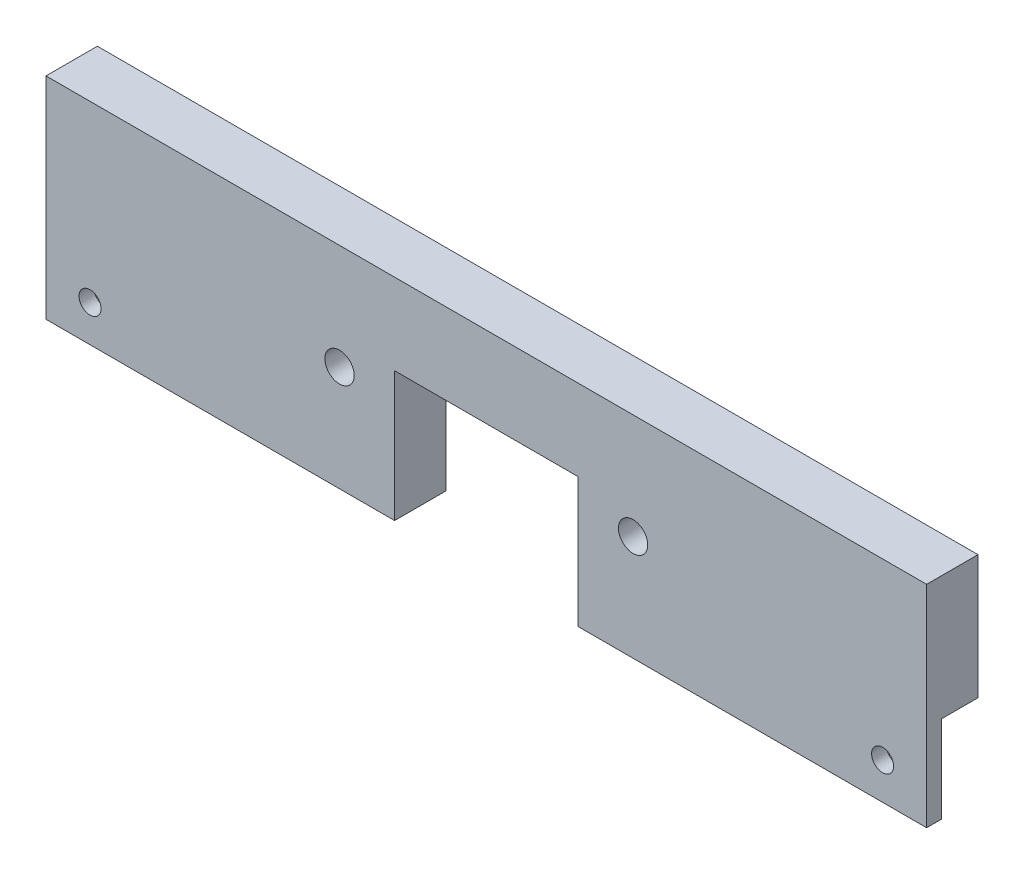
ISO-10303-21;
HEADER;
FILE_DESCRIPTION(('STEP AP214'),'2;1');
FILE_NAME('part.step','',(''),(''),'','','');
FILE_SCHEMA(('AUTOMOTIVE_DESIGN { 1 0 10303 214 1 1 1 1 }'));
ENDSEC;
DATA;
#1=APPLICATION_CONTEXT('core data for automotive mechanical design processes');
#2=APPLICATION_PROTOCOL_DEFINITION('international standard','automotive_design',2000,#1);
#3=PRODUCT_CONTEXT('',#1,'mechanical');
#4=PRODUCT('Part','Part','',(#3));
#5=PRODUCT_RELATED_PRODUCT_CATEGORY('part','',(#4));
#6=PRODUCT_DEFINITION_FORMATION('','',#4);
#7=PRODUCT_DEFINITION_CONTEXT('part definition',#1,'design');
#8=PRODUCT_DEFINITION('design','',#6,#7);
#9=PRODUCT_DEFINITION_SHAPE('','',#8);
#10=(LENGTH_UNIT() NAMED_UNIT(*) SI_UNIT(.MILLI.,.METRE.));
#11=(NAMED_UNIT(*) PLANE_ANGLE_UNIT() SI_UNIT($,.RADIAN.));
#12=(NAMED_UNIT(*) SI_UNIT($,.STERADIAN.) SOLID_ANGLE_UNIT());
#13=UNCERTAINTY_MEASURE_WITH_UNIT(LENGTH_MEASURE(1.E-05),#10,'distance_accuracy_value','');
#14=(GEOMETRIC_REPRESENTATION_CONTEXT(3) GLOBAL_UNCERTAINTY_ASSIGNED_CONTEXT((#13)) GLOBAL_UNIT_ASSIGNED_CONTEXT((#10,
#11,#12)) REPRESENTATION_CONTEXT('',''));
#15=CARTESIAN_POINT('',(0.,0.,0.));
#16=DIRECTION('',(0.,0.,1.));
#17=DIRECTION('',(1.,0.,0.));
#18=AXIS2_PLACEMENT_3D('',#15,#16,#17);
#19=CARTESIAN_POINT('',(-60.,11.27,7.));
#20=DIRECTION('',(0.,1.,0.));
#21=DIRECTION('',(-1.,0.,0.));
#22=AXIS2_PLACEMENT_3D('',#19,#20,#21);
#23=PLANE('',#22);
#24=DIRECTION('',(1.,0.,0.));
#25=VECTOR('',#24,1.);
#26=CARTESIAN_POINT('',(-60.,11.27,0.));
#27=LINE('',#26,#25);
#28=CARTESIAN_POINT('',(-48.,11.27,0.));
#29=VERTEX_POINT('',#28);
#30=CARTESIAN_POINT('',(-12.5,11.27,0.));
#31=VERTEX_POINT('',#30);
#32=EDGE_CURVE('E232',#29,#31,#27,.T.);
#33=ORIENTED_EDGE('',*,*,#32,.T.);
#34=DIRECTION('',(0.,0.,1.));
#35=VECTOR('',#34,1.);
#36=CARTESIAN_POINT('',(-12.5,11.27,7.));
#37=LINE('',#36,#35);
#38=CARTESIAN_POINT('',(-12.5,11.27,7.));
#39=VERTEX_POINT('',#38);
#40=EDGE_CURVE('E11',#31,#39,#37,.T.);
#41=ORIENTED_EDGE('',*,*,#40,.T.);
#42=DIRECTION('',(1.,0.,0.));
#43=VECTOR('',#42,1.);
#44=CARTESIAN_POINT('',(-60.,11.27,7.));
#45=LINE('',#44,#43);
#46=CARTESIAN_POINT('',(-60.,11.27,7.));
#47=VERTEX_POINT('',#46);
#48=EDGE_CURVE('E221',#47,#39,#45,.T.);
#49=ORIENTED_EDGE('',*,*,#48,.F.);
#50=DIRECTION('',(0.,0.,-1.));
#51=VECTOR('',#50,1.);
#52=CARTESIAN_POINT('',(-60.,11.27,7.));
#53=LINE('',#52,#51);
#54=CARTESIAN_POINT('',(-60.,11.27,5.));
#55=VERTEX_POINT('',#54);
#56=EDGE_CURVE('E245',#47,#55,#53,.T.);
#57=ORIENTED_EDGE('',*,*,#56,.T.);
#58=DIRECTION('',(1.,0.,0.));
#59=VECTOR('',#58,1.);
#60=CARTESIAN_POINT('',(-60.,11.27,5.));
#61=LINE('',#60,#59);
#62=CARTESIAN_POINT('',(-48.,11.27,5.));
#63=VERTEX_POINT('',#62);
#64=EDGE_CURVE('E181',#55,#63,#61,.T.);
#65=ORIENTED_EDGE('',*,*,#64,.T.);
#66=DIRECTION('',(0.,0.,-1.));
#67=VECTOR('',#66,1.);
#68=CARTESIAN_POINT('',(-48.,11.27,7.));
#69=LINE('',#68,#67);
#70=EDGE_CURVE('E253',#63,#29,#69,.T.);
#71=ORIENTED_EDGE('',*,*,#70,.T.);
#72=EDGE_LOOP('',(#33,#41,#49,#57,#65,#71));
#73=FACE_BOUND('',#72,.T.);
#74=ADVANCED_FACE('F32',(#73),#23,.F.);
#75=CARTESIAN_POINT('',(54.,16.27,7.));
#76=DIRECTION('',(0.,0.,-1.));
#77=DIRECTION('',(-1.,0.,0.));
#78=AXIS2_PLACEMENT_3D('',#75,#76,#77);
#79=CYLINDRICAL_SURFACE('',#78,1.5);
#80=CARTESIAN_POINT('',(54.,16.27,7.));
#81=DIRECTION('',(0.,0.,1.));
#82=DIRECTION('',(1.,0.,0.));
#83=AXIS2_PLACEMENT_3D('',#80,#81,#82);
#84=CIRCLE('',#83,1.5);
#85=CARTESIAN_POINT('',(55.5,16.27,7.));
#86=VERTEX_POINT('',#85);
#87=EDGE_CURVE('E209',#86,#86,#84,.T.);
#88=ORIENTED_EDGE('',*,*,#87,.T.);
#89=EDGE_LOOP('',(#88));
#90=FACE_BOUND('',#89,.T.);
#91=CARTESIAN_POINT('',(54.,16.27,5.));
#92=DIRECTION('',(0.,0.,-1.));
#93=DIRECTION('',(-1.,0.,0.));
#94=AXIS2_PLACEMENT_3D('',#91,#92,#93);
#95=CIRCLE('',#94,1.5);
#96=CARTESIAN_POINT('',(52.5,16.27,5.));
#97=VERTEX_POINT('',#96);
#98=EDGE_CURVE('E198',#97,#97,#95,.T.);
#99=ORIENTED_EDGE('',*,*,#98,.T.);
#100=EDGE_LOOP('',(#99));
#101=FACE_BOUND('',#100,.T.);
#102=ADVANCED_FACE('F295',(#90,#101),#79,.F.);
#103=CARTESIAN_POINT('',(0.,0.,7.));
#104=DIRECTION('',(0.,0.,-1.));
#105=DIRECTION('',(-1.,0.,0.));
#106=AXIS2_PLACEMENT_3D('',#103,#104,#105);
#107=PLANE('',#106);
#108=ORIENTED_EDGE('',*,*,#48,.T.);
#109=DIRECTION('',(0.,-1.,0.));
#110=VECTOR('',#109,1.);
#111=CARTESIAN_POINT('',(-12.5,-17.7863102306264,7.));
#112=LINE('',#111,#110);
#113=CARTESIAN_POINT('',(-12.5,28.9607474705575,7.));
#114=VERTEX_POINT('',#113);
#115=EDGE_CURVE('E156',#114,#39,#112,.T.);
#116=ORIENTED_EDGE('',*,*,#115,.F.);
#117=DIRECTION('',(-1.,0.,0.));
#118=VECTOR('',#117,1.);
#119=CARTESIAN_POINT('',(-12.5,28.9607474705575,7.));
#120=LINE('',#119,#118);
#121=CARTESIAN_POINT('',(12.5,28.9607474705575,7.));
#122=VERTEX_POINT('',#121);
#123=EDGE_CURVE('E151',#122,#114,#120,.T.);
#124=ORIENTED_EDGE('',*,*,#123,.F.);
#125=DIRECTION('',(0.,1.,0.));
#126=VECTOR('',#125,1.);
#127=CARTESIAN_POINT('',(12.5,-17.7863102306264,7.));
#128=LINE('',#127,#126);
#129=CARTESIAN_POINT('',(12.5,11.27,7.));
#130=VERTEX_POINT('',#129);
#131=EDGE_CURVE('E161',#130,#122,#128,.T.);
#132=ORIENTED_EDGE('',*,*,#131,.F.);
#133=CARTESIAN_POINT('',(60.,11.27,7.));
#134=VERTEX_POINT('',#133);
#135=EDGE_CURVE('E219',#130,#134,#45,.T.);
#136=ORIENTED_EDGE('',*,*,#135,.T.);
#137=DIRECTION('',(0.,1.,0.));
#138=VECTOR('',#137,1.);
#139=CARTESIAN_POINT('',(60.,11.27,7.));
#140=LINE('',#139,#138);
#141=CARTESIAN_POINT('',(60.,40.,7.));
#142=VERTEX_POINT('',#141);
#143=EDGE_CURVE('E224',#134,#142,#140,.T.);
#144=ORIENTED_EDGE('',*,*,#143,.T.);
#145=DIRECTION('',(-1.,0.,0.));
#146=VECTOR('',#145,1.);
#147=CARTESIAN_POINT('',(-60.,40.,7.));
#148=LINE('',#147,#146);
#149=CARTESIAN_POINT('',(-60.,40.,7.));
#150=VERTEX_POINT('',#149);
#151=EDGE_CURVE('E226',#142,#150,#148,.T.);
#152=ORIENTED_EDGE('',*,*,#151,.T.);
#153=DIRECTION('',(0.,-1.,0.));
#154=VECTOR('',#153,1.);
#155=CARTESIAN_POINT('',(-60.,11.27,7.));
#156=LINE('',#155,#154);
#157=EDGE_CURVE('E216',#150,#47,#156,.T.);
#158=ORIENTED_EDGE('',*,*,#157,.T.);
#159=EDGE_LOOP('',(#108,#116,#124,#132,#136,#144,#152,#158));
#160=FACE_BOUND('',#159,.T.);
#161=CARTESIAN_POINT('',(-54.,16.27,7.));
#162=DIRECTION('',(0.,0.,1.));
#163=DIRECTION('',(1.,0.,0.));
#164=AXIS2_PLACEMENT_3D('',#161,#162,#163);
#165=CIRCLE('',#164,1.5);
#166=CARTESIAN_POINT('',(-52.5,16.27,7.));
#167=VERTEX_POINT('',#166);
#168=EDGE_CURVE('E212',#167,#167,#165,.T.);
#169=ORIENTED_EDGE('',*,*,#168,.F.);
#170=EDGE_LOOP('',(#169));
#171=FACE_BOUND('',#170,.T.);
#172=ORIENTED_EDGE('',*,*,#87,.F.);
#173=EDGE_LOOP('',(#172));
#174=FACE_BOUND('',#173,.T.);
#175=CARTESIAN_POINT('',(-20.,25.635,7.));
#176=DIRECTION('',(0.,0.,1.));
#177=DIRECTION('',(1.,0.,0.));
#178=AXIS2_PLACEMENT_3D('',#175,#176,#177);
#179=CIRCLE('',#178,2.);
#180=CARTESIAN_POINT('',(-18.,25.635,7.));
#181=VERTEX_POINT('',#180);
#182=EDGE_CURVE('E206',#181,#181,#179,.T.);
#183=ORIENTED_EDGE('',*,*,#182,.F.);
#184=EDGE_LOOP('',(#183));
#185=FACE_BOUND('',#184,.T.);
#186=CARTESIAN_POINT('',(20.,25.635,7.));
#187=DIRECTION('',(0.,0.,1.));
#188=DIRECTION('',(-1.,0.,0.));
#189=AXIS2_PLACEMENT_3D('',#186,#187,#188);
#190=CIRCLE('',#189,2.);
#191=CARTESIAN_POINT('',(18.,25.635,7.));
#192=VERTEX_POINT('',#191);
#193=EDGE_CURVE('E203',#192,#192,#190,.T.);
#194=ORIENTED_EDGE('',*,*,#193,.F.);
#195=EDGE_LOOP('',(#194));
#196=FACE_BOUND('',#195,.T.);
#197=ADVANCED_FACE('F292',(#160,#171,#174,#185,#196),#107,.F.);
#198=CARTESIAN_POINT('',(0.,0.,0.));
#199=DIRECTION('',(0.,0.,-1.));
#200=DIRECTION('',(-1.,0.,0.));
#201=AXIS2_PLACEMENT_3D('',#198,#199,#200);
#202=PLANE('',#201);
#203=CARTESIAN_POINT('',(-20.,25.635,0.));
#204=DIRECTION('',(0.,0.,1.));
#205=DIRECTION('',(1.,0.,0.));
#206=AXIS2_PLACEMENT_3D('',#203,#204,#205);
#207=CIRCLE('',#206,4.);
#208=CARTESIAN_POINT('',(-16.,25.635,0.));
#209=VERTEX_POINT('',#208);
#210=EDGE_CURVE('E271',#209,#209,#207,.T.);
#211=ORIENTED_EDGE('',*,*,#210,.T.);
#212=EDGE_LOOP('',(#211));
#213=FACE_BOUND('',#212,.T.);
#214=CARTESIAN_POINT('',(20.,25.635,0.));
#215=DIRECTION('',(0.,0.,1.));
#216=DIRECTION('',(1.,0.,0.));
#217=AXIS2_PLACEMENT_3D('',#214,#215,#216);
#218=CIRCLE('',#217,4.);
#219=CARTESIAN_POINT('',(24.,25.635,0.));
#220=VERTEX_POINT('',#219);
#221=EDGE_CURVE('E264',#220,#220,#218,.T.);
#222=ORIENTED_EDGE('',*,*,#221,.T.);
#223=EDGE_LOOP('',(#222));
#224=FACE_BOUND('',#223,.T.);
#225=DIRECTION('',(0.,-1.,0.));
#226=VECTOR('',#225,1.);
#227=CARTESIAN_POINT('',(-12.5,-17.7863102306264,0.));
#228=LINE('',#227,#226);
#229=CARTESIAN_POINT('',(-12.5,28.9607474705575,0.));
#230=VERTEX_POINT('',#229);
#231=EDGE_CURVE('E136',#230,#31,#228,.T.);
#232=ORIENTED_EDGE('',*,*,#231,.T.);
#233=ORIENTED_EDGE('',*,*,#32,.F.);
#234=DIRECTION('',(0.,-1.,0.));
#235=VECTOR('',#234,1.);
#236=CARTESIAN_POINT('',(-48.,23.11,0.));
#237=LINE('',#236,#235);
#238=CARTESIAN_POINT('',(-48.,23.11,0.));
#239=VERTEX_POINT('',#238);
#240=EDGE_CURVE('E170',#239,#29,#237,.T.);
#241=ORIENTED_EDGE('',*,*,#240,.F.);
#242=DIRECTION('',(1.,0.,0.));
#243=VECTOR('',#242,1.);
#244=CARTESIAN_POINT('',(-60.,23.11,0.));
#245=LINE('',#244,#243);
#246=CARTESIAN_POINT('',(-60.,23.11,0.));
#247=VERTEX_POINT('',#246);
#248=EDGE_CURVE('E166',#247,#239,#245,.T.);
#249=ORIENTED_EDGE('',*,*,#248,.F.);
#250=DIRECTION('',(0.,-1.,0.));
#251=VECTOR('',#250,1.);
#252=CARTESIAN_POINT('',(-60.,11.27,0.));
#253=LINE('',#252,#251);
#254=CARTESIAN_POINT('',(-60.,40.,0.));
#255=VERTEX_POINT('',#254);
#256=EDGE_CURVE('E215',#255,#247,#253,.T.);
#257=ORIENTED_EDGE('',*,*,#256,.F.);
#258=DIRECTION('',(-1.,0.,0.));
#259=VECTOR('',#258,1.);
#260=CARTESIAN_POINT('',(-60.,40.,0.));
#261=LINE('',#260,#259);
#262=CARTESIAN_POINT('',(60.,40.,0.));
#263=VERTEX_POINT('',#262);
#264=EDGE_CURVE('E220',#263,#255,#261,.T.);
#265=ORIENTED_EDGE('',*,*,#264,.F.);
#266=DIRECTION('',(0.,1.,0.));
#267=VECTOR('',#266,1.);
#268=CARTESIAN_POINT('',(60.,11.27,0.));
#269=LINE('',#268,#267);
#270=CARTESIAN_POINT('',(60.,23.11,0.));
#271=VERTEX_POINT('',#270);
#272=EDGE_CURVE('E234',#271,#263,#269,.T.);
#273=ORIENTED_EDGE('',*,*,#272,.F.);
#274=DIRECTION('',(1.,0.,0.));
#275=VECTOR('',#274,1.);
#276=CARTESIAN_POINT('',(60.,23.11,0.));
#277=LINE('',#276,#275);
#278=CARTESIAN_POINT('',(48.,23.11,0.));
#279=VERTEX_POINT('',#278);
#280=EDGE_CURVE('E188',#279,#271,#277,.T.);
#281=ORIENTED_EDGE('',*,*,#280,.F.);
#282=DIRECTION('',(0.,1.,0.));
#283=VECTOR('',#282,1.);
#284=CARTESIAN_POINT('',(48.,23.11,0.));
#285=LINE('',#284,#283);
#286=CARTESIAN_POINT('',(48.,11.27,0.));
#287=VERTEX_POINT('',#286);
#288=EDGE_CURVE('E184',#287,#279,#285,.T.);
#289=ORIENTED_EDGE('',*,*,#288,.F.);
#290=CARTESIAN_POINT('',(12.5,11.27,0.));
#291=VERTEX_POINT('',#290);
#292=EDGE_CURVE('E231',#291,#287,#27,.T.);
#293=ORIENTED_EDGE('',*,*,#292,.F.);
#294=DIRECTION('',(0.,1.,0.));
#295=VECTOR('',#294,1.);
#296=CARTESIAN_POINT('',(12.5,-17.7863102306264,0.));
#297=LINE('',#296,#295);
#298=CARTESIAN_POINT('',(12.5,28.9607474705575,0.));
#299=VERTEX_POINT('',#298);
#300=EDGE_CURVE('E49',#291,#299,#297,.T.);
#301=ORIENTED_EDGE('',*,*,#300,.T.);
#302=DIRECTION('',(-1.,0.,0.));
#303=VECTOR('',#302,1.);
#304=CARTESIAN_POINT('',(-12.5,28.9607474705575,0.));
#305=LINE('',#304,#303);
#306=EDGE_CURVE('E149',#299,#230,#305,.T.);
#307=ORIENTED_EDGE('',*,*,#306,.T.);
#308=EDGE_LOOP('',(#232,#233,#241,#249,#257,#265,#273,#281,#289,#293,#301,#307));
#309=FACE_BOUND('',#308,.T.);
#310=ADVANCED_FACE('F154',(#213,#224,#309),#202,.T.);
#311=CARTESIAN_POINT('',(-60.,11.27,7.));
#312=DIRECTION('',(1.,0.,0.));
#313=DIRECTION('',(0.,0.,-1.));
#314=AXIS2_PLACEMENT_3D('',#311,#312,#313);
#315=PLANE('',#314);
#316=ORIENTED_EDGE('',*,*,#256,.T.);
#317=DIRECTION('',(0.,0.,-1.));
#318=VECTOR('',#317,1.);
#319=CARTESIAN_POINT('',(-60.,23.11,5.));
#320=LINE('',#319,#318);
#321=CARTESIAN_POINT('',(-60.,23.11,5.));
#322=VERTEX_POINT('',#321);
#323=EDGE_CURVE('E173',#322,#247,#320,.T.);
#324=ORIENTED_EDGE('',*,*,#323,.F.);
#325=DIRECTION('',(0.,1.,0.));
#326=VECTOR('',#325,1.);
#327=CARTESIAN_POINT('',(-60.,23.11,5.));
#328=LINE('',#327,#326);
#329=EDGE_CURVE('E167',#55,#322,#328,.T.);
#330=ORIENTED_EDGE('',*,*,#329,.F.);
#331=ORIENTED_EDGE('',*,*,#56,.F.);
#332=ORIENTED_EDGE('',*,*,#157,.F.);
#333=DIRECTION('',(0.,0.,-1.));
#334=VECTOR('',#333,1.);
#335=CARTESIAN_POINT('',(-60.,40.,7.));
#336=LINE('',#335,#334);
#337=EDGE_CURVE('E228',#150,#255,#336,.T.);
#338=ORIENTED_EDGE('',*,*,#337,.T.);
#339=EDGE_LOOP('',(#316,#324,#330,#331,#332,#338));
#340=FACE_BOUND('',#339,.T.);
#341=ADVANCED_FACE('F34',(#340),#315,.F.);
#342=ORIENTED_EDGE('',*,*,#135,.F.);
#343=DIRECTION('',(0.,0.,-1.));
#344=VECTOR('',#343,1.);
#345=CARTESIAN_POINT('',(12.5,11.27,7.));
#346=LINE('',#345,#344);
#347=EDGE_CURVE('E41',#130,#291,#346,.T.);
#348=ORIENTED_EDGE('',*,*,#347,.T.);
#349=ORIENTED_EDGE('',*,*,#292,.T.);
#350=DIRECTION('',(0.,0.,1.));
#351=VECTOR('',#350,1.);
#352=CARTESIAN_POINT('',(48.,11.27,7.));
#353=LINE('',#352,#351);
#354=CARTESIAN_POINT('',(48.,11.27,5.));
#355=VERTEX_POINT('',#354);
#356=EDGE_CURVE('E248',#287,#355,#353,.T.);
#357=ORIENTED_EDGE('',*,*,#356,.T.);
#358=DIRECTION('',(-1.,0.,0.));
#359=VECTOR('',#358,1.);
#360=CARTESIAN_POINT('',(-60.,11.27,5.));
#361=LINE('',#360,#359);
#362=CARTESIAN_POINT('',(60.,11.27,5.));
#363=VERTEX_POINT('',#362);
#364=EDGE_CURVE('E201',#363,#355,#361,.T.);
#365=ORIENTED_EDGE('',*,*,#364,.F.);
#366=DIRECTION('',(0.,0.,-1.));
#367=VECTOR('',#366,1.);
#368=CARTESIAN_POINT('',(60.,11.27,7.));
#369=LINE('',#368,#367);
#370=EDGE_CURVE('E242',#134,#363,#369,.T.);
#371=ORIENTED_EDGE('',*,*,#370,.F.);
#372=EDGE_LOOP('',(#342,#348,#349,#357,#365,#371));
#373=FACE_BOUND('',#372,.T.);
#374=ADVANCED_FACE('F312',(#373),#23,.F.);
#375=CARTESIAN_POINT('',(60.,11.27,7.));
#376=DIRECTION('',(-1.,0.,0.));
#377=DIRECTION('',(0.,0.,1.));
#378=AXIS2_PLACEMENT_3D('',#375,#376,#377);
#379=PLANE('',#378);
#380=DIRECTION('',(0.,-1.,0.));
#381=VECTOR('',#380,1.);
#382=CARTESIAN_POINT('',(60.,23.11,5.));
#383=LINE('',#382,#381);
#384=CARTESIAN_POINT('',(60.,23.11,5.));
#385=VERTEX_POINT('',#384);
#386=EDGE_CURVE('E185',#385,#363,#383,.T.);
#387=ORIENTED_EDGE('',*,*,#386,.F.);
#388=DIRECTION('',(0.,0.,-1.));
#389=VECTOR('',#388,1.);
#390=CARTESIAN_POINT('',(60.,23.11,5.));
#391=LINE('',#390,#389);
#392=EDGE_CURVE('E195',#385,#271,#391,.T.);
#393=ORIENTED_EDGE('',*,*,#392,.T.);
#394=ORIENTED_EDGE('',*,*,#272,.T.);
#395=DIRECTION('',(0.,0.,-1.));
#396=VECTOR('',#395,1.);
#397=CARTESIAN_POINT('',(60.,40.,7.));
#398=LINE('',#397,#396);
#399=EDGE_CURVE('E239',#142,#263,#398,.T.);
#400=ORIENTED_EDGE('',*,*,#399,.F.);
#401=ORIENTED_EDGE('',*,*,#143,.F.);
#402=ORIENTED_EDGE('',*,*,#370,.T.);
#403=EDGE_LOOP('',(#387,#393,#394,#400,#401,#402));
#404=FACE_BOUND('',#403,.T.);
#405=ADVANCED_FACE('F320',(#404),#379,.F.);
#406=CARTESIAN_POINT('',(-60.,40.,7.));
#407=DIRECTION('',(0.,-1.,0.));
#408=DIRECTION('',(0.,0.,-1.));
#409=AXIS2_PLACEMENT_3D('',#406,#407,#408);
#410=PLANE('',#409);
#411=ORIENTED_EDGE('',*,*,#264,.T.);
#412=ORIENTED_EDGE('',*,*,#337,.F.);
#413=ORIENTED_EDGE('',*,*,#151,.F.);
#414=ORIENTED_EDGE('',*,*,#399,.T.);
#415=EDGE_LOOP('',(#411,#412,#413,#414));
#416=FACE_BOUND('',#415,.T.);
#417=ADVANCED_FACE('F326',(#416),#410,.F.);
#418=CARTESIAN_POINT('',(-54.,16.27,7.));
#419=DIRECTION('',(0.,0.,-1.));
#420=DIRECTION('',(-1.,0.,0.));
#421=AXIS2_PLACEMENT_3D('',#418,#419,#420);
#422=CYLINDRICAL_SURFACE('',#421,1.5);
#423=CARTESIAN_POINT('',(-54.,16.27,5.));
#424=DIRECTION('',(0.,0.,1.));
#425=DIRECTION('',(1.,0.,0.));
#426=AXIS2_PLACEMENT_3D('',#423,#424,#425);
#427=CIRCLE('',#426,1.5);
#428=CARTESIAN_POINT('',(-52.5,16.27,5.));
#429=VERTEX_POINT('',#428);
#430=EDGE_CURVE('E179',#429,#429,#427,.T.);
#431=ORIENTED_EDGE('',*,*,#430,.F.);
#432=EDGE_LOOP('',(#431));
#433=FACE_BOUND('',#432,.T.);
#434=ORIENTED_EDGE('',*,*,#168,.T.);
#435=EDGE_LOOP('',(#434));
#436=FACE_BOUND('',#435,.T.);
#437=ADVANCED_FACE('F288',(#433,#436),#422,.F.);
#438=CARTESIAN_POINT('',(-20.,25.635,7.));
#439=DIRECTION('',(0.,0.,-1.));
#440=DIRECTION('',(-1.,0.,0.));
#441=AXIS2_PLACEMENT_3D('',#438,#439,#440);
#442=CYLINDRICAL_SURFACE('',#441,2.);
#443=CARTESIAN_POINT('',(-20.,25.635,2.));
#444=DIRECTION('',(0.,0.,1.));
#445=DIRECTION('',(1.,0.,0.));
#446=AXIS2_PLACEMENT_3D('',#443,#444,#445);
#447=CIRCLE('',#446,2.);
#448=CARTESIAN_POINT('',(-18.,25.635,2.));
#449=VERTEX_POINT('',#448);
#450=EDGE_CURVE('E36',#449,#449,#447,.T.);
#451=ORIENTED_EDGE('',*,*,#450,.F.);
#452=EDGE_LOOP('',(#451));
#453=FACE_BOUND('',#452,.T.);
#454=ORIENTED_EDGE('',*,*,#182,.T.);
#455=EDGE_LOOP('',(#454));
#456=FACE_BOUND('',#455,.T.);
#457=ADVANCED_FACE('F284',(#453,#456),#442,.F.);
#458=CARTESIAN_POINT('',(20.,25.635,7.));
#459=DIRECTION('',(0.,0.,-1.));
#460=DIRECTION('',(-1.,0.,0.));
#461=AXIS2_PLACEMENT_3D('',#458,#459,#460);
#462=CYLINDRICAL_SURFACE('',#461,2.);
#463=CARTESIAN_POINT('',(20.,25.635,2.));
#464=DIRECTION('',(0.,0.,1.));
#465=DIRECTION('',(1.,0.,0.));
#466=AXIS2_PLACEMENT_3D('',#463,#464,#465);
#467=CIRCLE('',#466,2.);
#468=CARTESIAN_POINT('',(22.,25.635,2.));
#469=VERTEX_POINT('',#468);
#470=EDGE_CURVE('E258',#469,#469,#467,.T.);
#471=ORIENTED_EDGE('',*,*,#470,.F.);
#472=EDGE_LOOP('',(#471));
#473=FACE_BOUND('',#472,.T.);
#474=ORIENTED_EDGE('',*,*,#193,.T.);
#475=EDGE_LOOP('',(#474));
#476=FACE_BOUND('',#475,.T.);
#477=ADVANCED_FACE('F287',(#473,#476),#462,.F.);
#478=CARTESIAN_POINT('',(48.,23.11,5.));
#479=DIRECTION('',(-1.,0.,0.));
#480=DIRECTION('',(0.,0.,1.));
#481=AXIS2_PLACEMENT_3D('',#478,#479,#480);
#482=PLANE('',#481);
#483=ORIENTED_EDGE('',*,*,#288,.T.);
#484=DIRECTION('',(0.,0.,-1.));
#485=VECTOR('',#484,1.);
#486=CARTESIAN_POINT('',(48.,23.11,5.));
#487=LINE('',#486,#485);
#488=CARTESIAN_POINT('',(48.,23.11,5.));
#489=VERTEX_POINT('',#488);
#490=EDGE_CURVE('E192',#489,#279,#487,.T.);
#491=ORIENTED_EDGE('',*,*,#490,.F.);
#492=DIRECTION('',(0.,1.,0.));
#493=VECTOR('',#492,1.);
#494=CARTESIAN_POINT('',(48.,23.11,5.));
#495=LINE('',#494,#493);
#496=EDGE_CURVE('E187',#355,#489,#495,.T.);
#497=ORIENTED_EDGE('',*,*,#496,.F.);
#498=ORIENTED_EDGE('',*,*,#356,.F.);
#499=EDGE_LOOP('',(#483,#491,#497,#498));
#500=FACE_BOUND('',#499,.T.);
#501=ADVANCED_FACE('F301',(#500),#482,.F.);
#502=CARTESIAN_POINT('',(0.,0.,5.));
#503=DIRECTION('',(0.,0.,-1.));
#504=DIRECTION('',(-1.,0.,0.));
#505=AXIS2_PLACEMENT_3D('',#502,#503,#504);
#506=PLANE('',#505);
#507=ORIENTED_EDGE('',*,*,#98,.F.);
#508=EDGE_LOOP('',(#507));
#509=FACE_BOUND('',#508,.T.);
#510=ORIENTED_EDGE('',*,*,#364,.T.);
#511=ORIENTED_EDGE('',*,*,#496,.T.);
#512=DIRECTION('',(1.,0.,0.));
#513=VECTOR('',#512,1.);
#514=CARTESIAN_POINT('',(60.,23.11,5.));
#515=LINE('',#514,#513);
#516=EDGE_CURVE('E190',#489,#385,#515,.T.);
#517=ORIENTED_EDGE('',*,*,#516,.T.);
#518=ORIENTED_EDGE('',*,*,#386,.T.);
#519=EDGE_LOOP('',(#510,#511,#517,#518));
#520=FACE_BOUND('',#519,.T.);
#521=ADVANCED_FACE('F307',(#509,#520),#506,.T.);
#522=CARTESIAN_POINT('',(60.,23.11,5.));
#523=DIRECTION('',(0.,1.,0.));
#524=DIRECTION('',(0.,0.,1.));
#525=AXIS2_PLACEMENT_3D('',#522,#523,#524);
#526=PLANE('',#525);
#527=ORIENTED_EDGE('',*,*,#280,.T.);
#528=ORIENTED_EDGE('',*,*,#392,.F.);
#529=ORIENTED_EDGE('',*,*,#516,.F.);
#530=ORIENTED_EDGE('',*,*,#490,.T.);
#531=EDGE_LOOP('',(#527,#528,#529,#530));
#532=FACE_BOUND('',#531,.T.);
#533=ADVANCED_FACE('F357',(#532),#526,.F.);
#534=CARTESIAN_POINT('',(-48.,23.11,5.));
#535=DIRECTION('',(1.,0.,0.));
#536=DIRECTION('',(0.,0.,-1.));
#537=AXIS2_PLACEMENT_3D('',#534,#535,#536);
#538=PLANE('',#537);
#539=DIRECTION('',(0.,-1.,0.));
#540=VECTOR('',#539,1.);
#541=CARTESIAN_POINT('',(-48.,23.11,5.));
#542=LINE('',#541,#540);
#543=CARTESIAN_POINT('',(-48.,23.11,5.));
#544=VERTEX_POINT('',#543);
#545=EDGE_CURVE('E57',#544,#63,#542,.T.);
#546=ORIENTED_EDGE('',*,*,#545,.F.);
#547=DIRECTION('',(0.,0.,-1.));
#548=VECTOR('',#547,1.);
#549=CARTESIAN_POINT('',(-48.,23.11,5.));
#550=LINE('',#549,#548);
#551=EDGE_CURVE('E177',#544,#239,#550,.T.);
#552=ORIENTED_EDGE('',*,*,#551,.T.);
#553=ORIENTED_EDGE('',*,*,#240,.T.);
#554=ORIENTED_EDGE('',*,*,#70,.F.);
#555=EDGE_LOOP('',(#546,#552,#553,#554));
#556=FACE_BOUND('',#555,.T.);
#557=ADVANCED_FACE('F353',(#556),#538,.F.);
#558=CARTESIAN_POINT('',(0.,0.,5.));
#559=DIRECTION('',(0.,0.,1.));
#560=DIRECTION('',(1.,0.,0.));
#561=AXIS2_PLACEMENT_3D('',#558,#559,#560);
#562=PLANE('',#561);
#563=ORIENTED_EDGE('',*,*,#430,.T.);
#564=EDGE_LOOP('',(#563));
#565=FACE_BOUND('',#564,.T.);
#566=ORIENTED_EDGE('',*,*,#329,.T.);
#567=DIRECTION('',(1.,0.,0.));
#568=VECTOR('',#567,1.);
#569=CARTESIAN_POINT('',(-60.,23.11,5.));
#570=LINE('',#569,#568);
#571=EDGE_CURVE('E169',#322,#544,#570,.T.);
#572=ORIENTED_EDGE('',*,*,#571,.T.);
#573=ORIENTED_EDGE('',*,*,#545,.T.);
#574=ORIENTED_EDGE('',*,*,#64,.F.);
#575=EDGE_LOOP('',(#566,#572,#573,#574));
#576=FACE_BOUND('',#575,.T.);
#577=ADVANCED_FACE('F350',(#565,#576),#562,.F.);
#578=CARTESIAN_POINT('',(-60.,23.11,5.));
#579=DIRECTION('',(0.,1.,0.));
#580=DIRECTION('',(0.,0.,1.));
#581=AXIS2_PLACEMENT_3D('',#578,#579,#580);
#582=PLANE('',#581);
#583=ORIENTED_EDGE('',*,*,#248,.T.);
#584=ORIENTED_EDGE('',*,*,#551,.F.);
#585=ORIENTED_EDGE('',*,*,#571,.F.);
#586=ORIENTED_EDGE('',*,*,#323,.T.);
#587=EDGE_LOOP('',(#583,#584,#585,#586));
#588=FACE_BOUND('',#587,.T.);
#589=ADVANCED_FACE('F345',(#588),#582,.F.);
#590=CARTESIAN_POINT('',(-12.5,-17.7863102306264,-53.0121439268194));
#591=DIRECTION('',(-1.,0.,0.));
#592=DIRECTION('',(0.,0.,1.));
#593=AXIS2_PLACEMENT_3D('',#590,#591,#592);
#594=PLANE('',#593);
#595=ORIENTED_EDGE('',*,*,#231,.F.);
#596=DIRECTION('',(0.,0.,1.));
#597=VECTOR('',#596,1.);
#598=CARTESIAN_POINT('',(-12.5,28.9607474705575,-53.0121439268194));
#599=LINE('',#598,#597);
#600=EDGE_CURVE('E139',#230,#114,#599,.T.);
#601=ORIENTED_EDGE('',*,*,#600,.T.);
#602=ORIENTED_EDGE('',*,*,#115,.T.);
#603=ORIENTED_EDGE('',*,*,#40,.F.);
#604=EDGE_LOOP('',(#595,#601,#602,#603));
#605=FACE_BOUND('',#604,.T.);
#606=ADVANCED_FACE('F138',(#605),#594,.F.);
#607=CARTESIAN_POINT('',(12.5,-17.7863102306264,-53.0121439268194));
#608=DIRECTION('',(1.,0.,0.));
#609=DIRECTION('',(0.,0.,-1.));
#610=AXIS2_PLACEMENT_3D('',#607,#608,#609);
#611=PLANE('',#610);
#612=ORIENTED_EDGE('',*,*,#131,.T.);
#613=DIRECTION('',(0.,0.,1.));
#614=VECTOR('',#613,1.);
#615=CARTESIAN_POINT('',(12.5,28.9607474705575,-53.0121439268194));
#616=LINE('',#615,#614);
#617=EDGE_CURVE('E163',#299,#122,#616,.T.);
#618=ORIENTED_EDGE('',*,*,#617,.F.);
#619=ORIENTED_EDGE('',*,*,#300,.F.);
#620=ORIENTED_EDGE('',*,*,#347,.F.);
#621=EDGE_LOOP('',(#612,#618,#619,#620));
#622=FACE_BOUND('',#621,.T.);
#623=ADVANCED_FACE('F336',(#622),#611,.F.);
#624=CARTESIAN_POINT('',(-12.5,28.9607474705575,-53.0121439268194));
#625=DIRECTION('',(0.,1.,0.));
#626=DIRECTION('',(0.,0.,1.));
#627=AXIS2_PLACEMENT_3D('',#624,#625,#626);
#628=PLANE('',#627);
#629=ORIENTED_EDGE('',*,*,#617,.T.);
#630=ORIENTED_EDGE('',*,*,#123,.T.);
#631=ORIENTED_EDGE('',*,*,#600,.F.);
#632=ORIENTED_EDGE('',*,*,#306,.F.);
#633=EDGE_LOOP('',(#629,#630,#631,#632));
#634=FACE_BOUND('',#633,.T.);
#635=ADVANCED_FACE('F148',(#634),#628,.F.);
#636=CARTESIAN_POINT('',(20.,25.635,2.));
#637=DIRECTION('',(0.,0.,-1.));
#638=DIRECTION('',(-1.,0.,0.));
#639=AXIS2_PLACEMENT_3D('',#636,#637,#638);
#640=CYLINDRICAL_SURFACE('',#639,4.);
#641=CARTESIAN_POINT('',(20.,25.635,2.));
#642=DIRECTION('',(0.,0.,1.));
#643=DIRECTION('',(1.,0.,0.));
#644=AXIS2_PLACEMENT_3D('',#641,#642,#643);
#645=CIRCLE('',#644,4.);
#646=CARTESIAN_POINT('',(24.,25.635,2.));
#647=VERTEX_POINT('',#646);
#648=EDGE_CURVE('E260',#647,#647,#645,.T.);
#649=ORIENTED_EDGE('',*,*,#648,.T.);
#650=EDGE_LOOP('',(#649));
#651=FACE_BOUND('',#650,.T.);
#652=ORIENTED_EDGE('',*,*,#221,.F.);
#653=EDGE_LOOP('',(#652));
#654=FACE_BOUND('',#653,.T.);
#655=ADVANCED_FACE('F343',(#651,#654),#640,.F.);
#656=CARTESIAN_POINT('',(20.,25.635,2.));
#657=DIRECTION('',(0.,0.,1.));
#658=DIRECTION('',(1.,0.,0.));
#659=AXIS2_PLACEMENT_3D('',#656,#657,#658);
#660=PLANE('',#659);
#661=ORIENTED_EDGE('',*,*,#470,.T.);
#662=EDGE_LOOP('',(#661));
#663=FACE_BOUND('',#662,.T.);
#664=ORIENTED_EDGE('',*,*,#648,.F.);
#665=EDGE_LOOP('',(#664));
#666=FACE_BOUND('',#665,.T.);
#667=ADVANCED_FACE('F405',(#663,#666),#660,.F.);
#668=CARTESIAN_POINT('',(-20.,25.635,2.));
#669=DIRECTION('',(0.,0.,-1.));
#670=DIRECTION('',(-1.,0.,0.));
#671=AXIS2_PLACEMENT_3D('',#668,#669,#670);
#672=CYLINDRICAL_SURFACE('',#671,4.);
#673=CARTESIAN_POINT('',(-20.,25.635,2.));
#674=DIRECTION('',(0.,0.,1.));
#675=DIRECTION('',(1.,0.,0.));
#676=AXIS2_PLACEMENT_3D('',#673,#674,#675);
#677=CIRCLE('',#676,4.);
#678=CARTESIAN_POINT('',(-16.,25.635,2.));
#679=VERTEX_POINT('',#678);
#680=EDGE_CURVE('E274',#679,#679,#677,.T.);
#681=ORIENTED_EDGE('',*,*,#680,.T.);
#682=EDGE_LOOP('',(#681));
#683=FACE_BOUND('',#682,.T.);
#684=ORIENTED_EDGE('',*,*,#210,.F.);
#685=EDGE_LOOP('',(#684));
#686=FACE_BOUND('',#685,.T.);
#687=ADVANCED_FACE('F409',(#683,#686),#672,.F.);
#688=CARTESIAN_POINT('',(-20.,25.635,2.));
#689=DIRECTION('',(0.,0.,1.));
#690=DIRECTION('',(1.,0.,0.));
#691=AXIS2_PLACEMENT_3D('',#688,#689,#690);
#692=PLANE('',#691);
#693=ORIENTED_EDGE('',*,*,#450,.T.);
#694=EDGE_LOOP('',(#693));
#695=FACE_BOUND('',#694,.T.);
#696=ORIENTED_EDGE('',*,*,#680,.F.);
#697=EDGE_LOOP('',(#696));
#698=FACE_BOUND('',#697,.T.);
#699=ADVANCED_FACE('F281',(#695,#698),#692,.F.);
#700=CLOSED_SHELL('',(#74,#102,#197,#310,#341,#374,#405,#417,#437,#457,#477,#501,#521,#533,#557,
#577,#589,#606,#623,#635,#655,#667,#687,#699));
#701=MANIFOLD_SOLID_BREP('B2',#700);
#702=ADVANCED_BREP_SHAPE_REPRESENTATION('',(#18,#701),#14);
#703=SHAPE_DEFINITION_REPRESENTATION(#9,#702);
ENDSEC;
END-ISO-10303-21;
